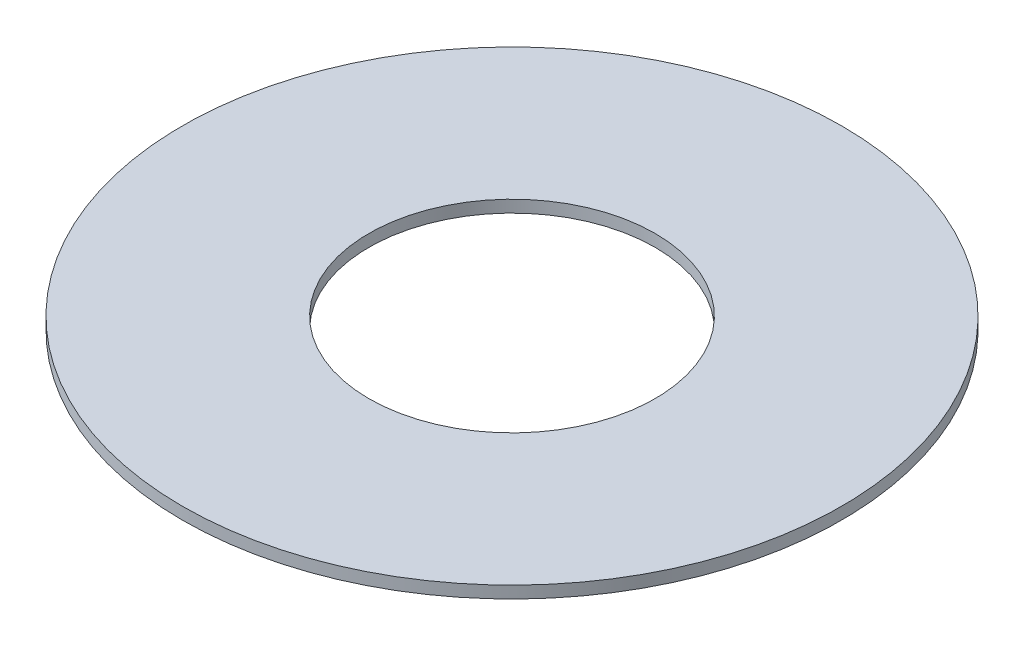
ISO-10303-21;
HEADER;
FILE_DESCRIPTION(('STEP AP214'),'2;1');
FILE_NAME('part.step','',(''),(''),'','','');
FILE_SCHEMA(('AUTOMOTIVE_DESIGN { 1 0 10303 214 1 1 1 1 }'));
ENDSEC;
DATA;
#1=APPLICATION_CONTEXT('core data for automotive mechanical design processes');
#2=APPLICATION_PROTOCOL_DEFINITION('international standard','automotive_design',2000,#1);
#3=PRODUCT_CONTEXT('',#1,'mechanical');
#4=PRODUCT('Part','Part','',(#3));
#5=PRODUCT_RELATED_PRODUCT_CATEGORY('part','',(#4));
#6=PRODUCT_DEFINITION_FORMATION('','',#4);
#7=PRODUCT_DEFINITION_CONTEXT('part definition',#1,'design');
#8=PRODUCT_DEFINITION('design','',#6,#7);
#9=PRODUCT_DEFINITION_SHAPE('','',#8);
#10=(LENGTH_UNIT() NAMED_UNIT(*) SI_UNIT(.MILLI.,.METRE.));
#11=(NAMED_UNIT(*) PLANE_ANGLE_UNIT() SI_UNIT($,.RADIAN.));
#12=(NAMED_UNIT(*) SI_UNIT($,.STERADIAN.) SOLID_ANGLE_UNIT());
#13=UNCERTAINTY_MEASURE_WITH_UNIT(LENGTH_MEASURE(1.E-05),#10,'distance_accuracy_value','');
#14=(GEOMETRIC_REPRESENTATION_CONTEXT(3) GLOBAL_UNCERTAINTY_ASSIGNED_CONTEXT((#13)) GLOBAL_UNIT_ASSIGNED_CONTEXT((#10,
#11,#12)) REPRESENTATION_CONTEXT('',''));
#15=CARTESIAN_POINT('',(0.,0.,0.));
#16=DIRECTION('',(0.,0.,1.));
#17=DIRECTION('',(1.,0.,0.));
#18=AXIS2_PLACEMENT_3D('',#15,#16,#17);
#19=CARTESIAN_POINT('',(0.,0.8128,0.));
#20=DIRECTION('',(0.,1.,0.));
#21=DIRECTION('',(0.,0.,1.));
#22=AXIS2_PLACEMENT_3D('',#19,#20,#21);
#23=PLANE('',#22);
#24=CARTESIAN_POINT('',(0.,0.8128,0.));
#25=DIRECTION('',(0.,1.,0.));
#26=DIRECTION('',(0.,0.,1.));
#27=AXIS2_PLACEMENT_3D('',#24,#25,#26);
#28=CIRCLE('',#27,22.225);
#29=CARTESIAN_POINT('',(0.,0.8128,22.225));
#30=VERTEX_POINT('',#29);
#31=EDGE_CURVE('E10',#30,#30,#28,.T.);
#32=ORIENTED_EDGE('',*,*,#31,.T.);
#33=EDGE_LOOP('',(#32));
#34=FACE_BOUND('',#33,.T.);
#35=CARTESIAN_POINT('',(0.,0.8128,0.));
#36=DIRECTION('',(0.,1.,0.));
#37=DIRECTION('',(0.,0.,1.));
#38=AXIS2_PLACEMENT_3D('',#35,#36,#37);
#39=CIRCLE('',#38,9.652);
#40=CARTESIAN_POINT('',(0.,0.8128,9.652));
#41=VERTEX_POINT('',#40);
#42=EDGE_CURVE('E47',#41,#41,#39,.T.);
#43=ORIENTED_EDGE('',*,*,#42,.F.);
#44=EDGE_LOOP('',(#43));
#45=FACE_BOUND('',#44,.T.);
#46=ADVANCED_FACE('F33',(#34,#45),#23,.T.);
#47=CARTESIAN_POINT('',(0.,0.,0.));
#48=DIRECTION('',(0.,1.,0.));
#49=DIRECTION('',(0.,0.,1.));
#50=AXIS2_PLACEMENT_3D('',#47,#48,#49);
#51=PLANE('',#50);
#52=CARTESIAN_POINT('',(0.,0.,0.));
#53=DIRECTION('',(0.,1.,0.));
#54=DIRECTION('',(0.,0.,1.));
#55=AXIS2_PLACEMENT_3D('',#52,#53,#54);
#56=CIRCLE('',#55,22.225);
#57=CARTESIAN_POINT('',(0.,0.,22.225));
#58=VERTEX_POINT('',#57);
#59=EDGE_CURVE('E37',#58,#58,#56,.T.);
#60=ORIENTED_EDGE('',*,*,#59,.F.);
#61=EDGE_LOOP('',(#60));
#62=FACE_BOUND('',#61,.T.);
#63=CARTESIAN_POINT('',(0.,0.,0.));
#64=DIRECTION('',(0.,1.,0.));
#65=DIRECTION('',(0.,0.,1.));
#66=AXIS2_PLACEMENT_3D('',#63,#64,#65);
#67=CIRCLE('',#66,9.652);
#68=CARTESIAN_POINT('',(0.,0.,9.652));
#69=VERTEX_POINT('',#68);
#70=EDGE_CURVE('E49',#69,#69,#67,.T.);
#71=ORIENTED_EDGE('',*,*,#70,.T.);
#72=EDGE_LOOP('',(#71));
#73=FACE_BOUND('',#72,.T.);
#74=ADVANCED_FACE('F62',(#62,#73),#51,.F.);
#75=CARTESIAN_POINT('',(0.,0.8128,0.));
#76=DIRECTION('',(0.,-1.,0.));
#77=DIRECTION('',(0.,0.,-1.));
#78=AXIS2_PLACEMENT_3D('',#75,#76,#77);
#79=CYLINDRICAL_SURFACE('',#78,22.225);
#80=ORIENTED_EDGE('',*,*,#31,.F.);
#81=EDGE_LOOP('',(#80));
#82=FACE_BOUND('',#81,.T.);
#83=ORIENTED_EDGE('',*,*,#59,.T.);
#84=EDGE_LOOP('',(#83));
#85=FACE_BOUND('',#84,.T.);
#86=ADVANCED_FACE('F35',(#82,#85),#79,.T.);
#87=CARTESIAN_POINT('',(0.,0.8128,0.));
#88=DIRECTION('',(0.,-1.,0.));
#89=DIRECTION('',(0.,0.,-1.));
#90=AXIS2_PLACEMENT_3D('',#87,#88,#89);
#91=CYLINDRICAL_SURFACE('',#90,9.652);
#92=ORIENTED_EDGE('',*,*,#42,.T.);
#93=EDGE_LOOP('',(#92));
#94=FACE_BOUND('',#93,.T.);
#95=ORIENTED_EDGE('',*,*,#70,.F.);
#96=EDGE_LOOP('',(#95));
#97=FACE_BOUND('',#96,.T.);
#98=ADVANCED_FACE('F58',(#94,#97),#91,.F.);
#99=CLOSED_SHELL('',(#46,#74,#86,#98));
#100=MANIFOLD_SOLID_BREP('B2',#99);
#101=ADVANCED_BREP_SHAPE_REPRESENTATION('',(#18,#100),#14);
#102=SHAPE_DEFINITION_REPRESENTATION(#9,#101);
ENDSEC;
END-ISO-10303-21;
